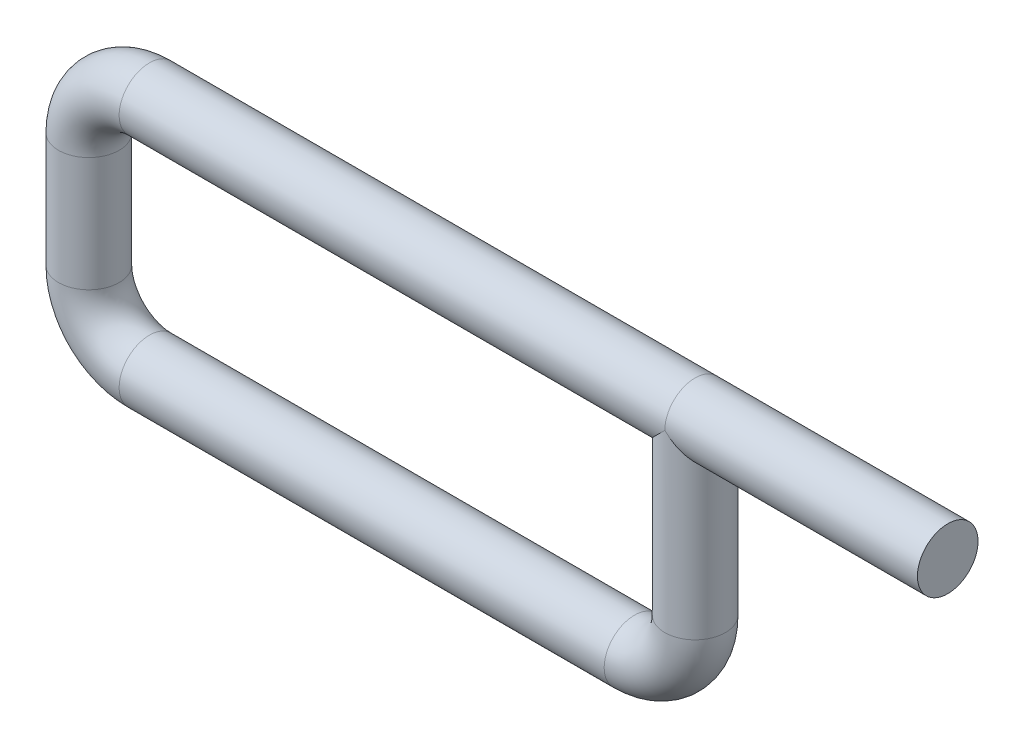
ISO-10303-21;
HEADER;
FILE_DESCRIPTION(('STEP AP214'),'2;1');
FILE_NAME('part.step','',(''),(''),'','','');
FILE_SCHEMA(('AUTOMOTIVE_DESIGN { 1 0 10303 214 1 1 1 1 }'));
ENDSEC;
DATA;
#1=APPLICATION_CONTEXT('core data for automotive mechanical design processes');
#2=APPLICATION_PROTOCOL_DEFINITION('international standard','automotive_design',2000,#1);
#3=PRODUCT_CONTEXT('',#1,'mechanical');
#4=PRODUCT('Part','Part','',(#3));
#5=PRODUCT_RELATED_PRODUCT_CATEGORY('part','',(#4));
#6=PRODUCT_DEFINITION_FORMATION('','',#4);
#7=PRODUCT_DEFINITION_CONTEXT('part definition',#1,'design');
#8=PRODUCT_DEFINITION('design','',#6,#7);
#9=PRODUCT_DEFINITION_SHAPE('','',#8);
#10=(LENGTH_UNIT() NAMED_UNIT(*) SI_UNIT(.MILLI.,.METRE.));
#11=(NAMED_UNIT(*) PLANE_ANGLE_UNIT() SI_UNIT($,.RADIAN.));
#12=(NAMED_UNIT(*) SI_UNIT($,.STERADIAN.) SOLID_ANGLE_UNIT());
#13=UNCERTAINTY_MEASURE_WITH_UNIT(LENGTH_MEASURE(1.E-05),#10,'distance_accuracy_value','');
#14=(GEOMETRIC_REPRESENTATION_CONTEXT(3) GLOBAL_UNCERTAINTY_ASSIGNED_CONTEXT((#13)) GLOBAL_UNIT_ASSIGNED_CONTEXT((#10,
#11,#12)) REPRESENTATION_CONTEXT('',''));
#15=CARTESIAN_POINT('',(0.,0.,0.));
#16=DIRECTION('',(0.,0.,1.));
#17=DIRECTION('',(1.,0.,0.));
#18=AXIS2_PLACEMENT_3D('',#15,#16,#17);
#19=CARTESIAN_POINT('',(717.,1070.,515.000000000015));
#20=DIRECTION('',(-1.,0.,0.));
#21=DIRECTION('',(0.,0.,1.));
#22=AXIS2_PLACEMENT_3D('',#19,#20,#21);
#23=PLANE('',#22);
#24=CARTESIAN_POINT('',(717.,1070.,515.000000000015));
#25=DIRECTION('',(-1.,0.,0.));
#26=DIRECTION('',(0.,0.,1.));
#27=AXIS2_PLACEMENT_3D('',#24,#25,#26);
#28=CIRCLE('',#27,9.00000000000001);
#29=CARTESIAN_POINT('',(717.,1070.,524.000000000015));
#30=VERTEX_POINT('',#29);
#31=EDGE_CURVE('E42',#30,#30,#28,.T.);
#32=ORIENTED_EDGE('',*,*,#31,.F.);
#33=EDGE_LOOP('',(#32));
#34=FACE_BOUND('',#33,.T.);
#35=ADVANCED_FACE('F35',(#34),#23,.F.);
#36=CARTESIAN_POINT('',(624.,1018.,515.000000000015));
#37=DIRECTION('',(0.,0.,-1.));
#38=DIRECTION('',(-1.,0.,0.));
#39=AXIS2_PLACEMENT_3D('',#36,#37,#38);
#40=TOROIDAL_SURFACE('',#39,18.0000000000001,9.00000000000001);
#41=CARTESIAN_POINT('',(642.,1018.,515.000000000015));
#42=DIRECTION('',(0.,1.,0.));
#43=DIRECTION('',(0.,0.,1.));
#44=AXIS2_PLACEMENT_3D('',#41,#42,#43);
#45=CIRCLE('',#44,9.00000000000001);
#46=CARTESIAN_POINT('',(651.,1018.,515.000000000015));
#47=VERTEX_POINT('',#46);
#48=EDGE_CURVE('E57',#47,#47,#45,.T.);
#49=CARTESIAN_POINT('',(624.,1000.,515.000000000015));
#50=DIRECTION('',(1.,0.,0.));
#51=DIRECTION('',(0.,0.,1.));
#52=AXIS2_PLACEMENT_3D('',#49,#50,#51);
#53=CIRCLE('',#52,9.00000000000001);
#54=CARTESIAN_POINT('',(624.,990.999999999999,515.000000000015));
#55=VERTEX_POINT('',#54);
#56=EDGE_CURVE('E75',#55,#55,#53,.T.);
#57=CARTESIAN_POINT('',(624.,1018.,515.000000000015));
#58=DIRECTION('',(0.,0.,-1.));
#59=DIRECTION('',(-1.,0.,0.));
#60=AXIS2_PLACEMENT_3D('',#57,#58,#59);
#61=CIRCLE('',#60,27.0000000000001);
#62=EDGE_CURVE('',#47,#55,#61,.T.);
#63=ORIENTED_EDGE('',*,*,#48,.F.);
#64=ORIENTED_EDGE('',*,*,#56,.T.);
#65=ORIENTED_EDGE('',*,*,#62,.T.);
#66=ORIENTED_EDGE('',*,*,#62,.F.);
#67=EDGE_LOOP('',(#63,#65,#64,#66));
#68=FACE_BOUND('',#67,.T.);
#69=ADVANCED_FACE('F82',(#68),#40,.T.);
#70=CARTESIAN_POINT('',(624.,999.999999999999,515.000000000015));
#71=DIRECTION('',(-1.,0.,0.));
#72=DIRECTION('',(0.,-1.,0.));
#73=AXIS2_PLACEMENT_3D('',#70,#71,#72);
#74=CYLINDRICAL_SURFACE('',#73,9.00000000000001);
#75=CARTESIAN_POINT('',(480.,999.999999999999,515.000000000015));
#76=DIRECTION('',(1.,0.,0.));
#77=DIRECTION('',(0.,0.,1.));
#78=AXIS2_PLACEMENT_3D('',#75,#76,#77);
#79=CIRCLE('',#78,9.00000000000001);
#80=CARTESIAN_POINT('',(480.,991.,515.000000000015));
#81=VERTEX_POINT('',#80);
#82=EDGE_CURVE('E72',#81,#81,#79,.T.);
#83=ORIENTED_EDGE('',*,*,#82,.T.);
#84=EDGE_LOOP('',(#83));
#85=FACE_BOUND('',#84,.T.);
#86=ORIENTED_EDGE('',*,*,#56,.F.);
#87=EDGE_LOOP('',(#86));
#88=FACE_BOUND('',#87,.T.);
#89=ADVANCED_FACE('F84',(#85,#88),#74,.T.);
#90=CARTESIAN_POINT('',(480.,1018.,515.000000000015));
#91=DIRECTION('',(0.,0.,-1.));
#92=DIRECTION('',(-1.,0.,0.));
#93=AXIS2_PLACEMENT_3D('',#90,#91,#92);
#94=TOROIDAL_SURFACE('',#93,17.9999999999998,9.00000000000001);
#95=CARTESIAN_POINT('',(462.,1018.,515.000000000015));
#96=DIRECTION('',(0.,-1.,0.));
#97=DIRECTION('',(0.,0.,1.));
#98=AXIS2_PLACEMENT_3D('',#95,#96,#97);
#99=CIRCLE('',#98,9.00000000000001);
#100=CARTESIAN_POINT('',(453.,1018.,515.000000000015));
#101=VERTEX_POINT('',#100);
#102=EDGE_CURVE('E69',#101,#101,#99,.T.);
#103=CARTESIAN_POINT('',(480.,1018.,515.000000000015));
#104=DIRECTION('',(0.,0.,-1.));
#105=DIRECTION('',(-1.,0.,0.));
#106=AXIS2_PLACEMENT_3D('',#103,#104,#105);
#107=CIRCLE('',#106,26.9999999999998);
#108=EDGE_CURVE('',#81,#101,#107,.T.);
#109=ORIENTED_EDGE('',*,*,#82,.F.);
#110=ORIENTED_EDGE('',*,*,#102,.T.);
#111=ORIENTED_EDGE('',*,*,#108,.T.);
#112=ORIENTED_EDGE('',*,*,#108,.F.);
#113=EDGE_LOOP('',(#109,#111,#110,#112));
#114=FACE_BOUND('',#113,.T.);
#115=ADVANCED_FACE('F91',(#114),#94,.T.);
#116=CARTESIAN_POINT('',(462.,1018.,515.000000000015));
#117=DIRECTION('',(0.,1.,0.));
#118=DIRECTION('',(0.,0.,1.));
#119=AXIS2_PLACEMENT_3D('',#116,#117,#118);
#120=CYLINDRICAL_SURFACE('',#119,9.00000000000001);
#121=CARTESIAN_POINT('',(462.,1052.,515.000000000015));
#122=DIRECTION('',(0.,-1.,0.));
#123=DIRECTION('',(0.,0.,1.));
#124=AXIS2_PLACEMENT_3D('',#121,#122,#123);
#125=CIRCLE('',#124,9.00000000000001);
#126=CARTESIAN_POINT('',(453.,1052.,515.000000000015));
#127=VERTEX_POINT('',#126);
#128=EDGE_CURVE('E64',#127,#127,#125,.T.);
#129=ORIENTED_EDGE('',*,*,#128,.T.);
#130=EDGE_LOOP('',(#129));
#131=FACE_BOUND('',#130,.T.);
#132=ORIENTED_EDGE('',*,*,#102,.F.);
#133=EDGE_LOOP('',(#132));
#134=FACE_BOUND('',#133,.T.);
#135=ADVANCED_FACE('F107',(#131,#134),#120,.T.);
#136=CARTESIAN_POINT('',(480.,1052.,515.000000000015));
#137=DIRECTION('',(0.,0.,-1.));
#138=DIRECTION('',(-1.,0.,0.));
#139=AXIS2_PLACEMENT_3D('',#136,#137,#138);
#140=TOROIDAL_SURFACE('',#139,18.,9.00000000000001);
#141=CARTESIAN_POINT('',(480.,1070.,515.000000000015));
#142=DIRECTION('',(-1.,0.,0.));
#143=DIRECTION('',(0.,0.,1.));
#144=AXIS2_PLACEMENT_3D('',#141,#142,#143);
#145=CIRCLE('',#144,9.00000000000001);
#146=CARTESIAN_POINT('',(480.,1079.,515.000000000015));
#147=VERTEX_POINT('',#146);
#148=EDGE_CURVE('E60',#147,#147,#145,.T.);
#149=CARTESIAN_POINT('',(480.,1052.,515.000000000015));
#150=DIRECTION('',(0.,0.,-1.));
#151=DIRECTION('',(-1.,0.,0.));
#152=AXIS2_PLACEMENT_3D('',#149,#150,#151);
#153=CIRCLE('',#152,27.);
#154=EDGE_CURVE('',#127,#147,#153,.T.);
#155=ORIENTED_EDGE('',*,*,#128,.F.);
#156=ORIENTED_EDGE('',*,*,#148,.T.);
#157=ORIENTED_EDGE('',*,*,#154,.T.);
#158=ORIENTED_EDGE('',*,*,#154,.F.);
#159=EDGE_LOOP('',(#155,#157,#156,#158));
#160=FACE_BOUND('',#159,.T.);
#161=ADVANCED_FACE('F102',(#160),#140,.T.);
#162=CARTESIAN_POINT('',(480.,1070.,515.000000000015));
#163=DIRECTION('',(1.,0.,0.));
#164=DIRECTION('',(0.,0.,-1.));
#165=AXIS2_PLACEMENT_3D('',#162,#163,#164);
#166=CYLINDRICAL_SURFACE('',#165,9.00000000000001);
#167=CARTESIAN_POINT('',(642.,1070.,515.000000000015));
#168=DIRECTION('',(-1.,0.,0.));
#169=DIRECTION('',(0.,0.,1.));
#170=AXIS2_PLACEMENT_3D('',#167,#168,#169);
#171=CIRCLE('',#170,9.00000000000001);
#172=CARTESIAN_POINT('',(642.,1070.,524.000000000015));
#173=VERTEX_POINT('',#172);
#174=CARTESIAN_POINT('',(642.,1070.,506.000000000015));
#175=VERTEX_POINT('',#174);
#176=EDGE_CURVE('E56',#173,#175,#171,.T.);
#177=ORIENTED_EDGE('',*,*,#176,.T.);
#178=CARTESIAN_POINT('',(642.,1070.,515.000000000015));
#179=DIRECTION('',(0.707106781186547,-0.707106781186547,0.));
#180=DIRECTION('',(0.707106781186547,0.707106781186547,0.));
#181=AXIS2_PLACEMENT_3D('',#178,#179,#180);
#182=ELLIPSE('',#181,12.7279220613579,9.00000000000001);
#183=EDGE_CURVE('E48',#175,#173,#182,.F.);
#184=ORIENTED_EDGE('',*,*,#183,.T.);
#185=EDGE_LOOP('',(#177,#184));
#186=FACE_BOUND('',#185,.T.);
#187=ORIENTED_EDGE('',*,*,#148,.F.);
#188=EDGE_LOOP('',(#187));
#189=FACE_BOUND('',#188,.T.);
#190=ADVANCED_FACE('F54',(#186,#189),#166,.T.);
#191=CARTESIAN_POINT('',(642.,1070.,515.000000000015));
#192=DIRECTION('',(1.,0.,0.));
#193=DIRECTION('',(0.,0.,-1.));
#194=AXIS2_PLACEMENT_3D('',#191,#192,#193);
#195=CYLINDRICAL_SURFACE('',#194,9.00000000000001);
#196=ORIENTED_EDGE('',*,*,#31,.T.);
#197=EDGE_LOOP('',(#196));
#198=FACE_BOUND('',#197,.T.);
#199=ORIENTED_EDGE('',*,*,#176,.F.);
#200=CARTESIAN_POINT('',(642.,1070.,515.000000000015));
#201=DIRECTION('',(0.707106781186547,0.707106781186547,0.));
#202=DIRECTION('',(0.707106781186547,-0.707106781186547,0.));
#203=AXIS2_PLACEMENT_3D('',#200,#201,#202);
#204=ELLIPSE('',#203,12.7279220613579,9.00000000000001);
#205=EDGE_CURVE('E11',#173,#175,#204,.T.);
#206=ORIENTED_EDGE('',*,*,#205,.T.);
#207=EDGE_LOOP('',(#199,#206));
#208=FACE_BOUND('',#207,.T.);
#209=ADVANCED_FACE('F59',(#198,#208),#195,.T.);
#210=CARTESIAN_POINT('',(642.,1070.,515.000000000015));
#211=DIRECTION('',(0.,-1.,0.));
#212=DIRECTION('',(0.,0.,-1.));
#213=AXIS2_PLACEMENT_3D('',#210,#211,#212);
#214=CYLINDRICAL_SURFACE('',#213,9.00000000000001);
#215=ORIENTED_EDGE('',*,*,#48,.T.);
#216=EDGE_LOOP('',(#215));
#217=FACE_BOUND('',#216,.T.);
#218=ORIENTED_EDGE('',*,*,#183,.F.);
#219=ORIENTED_EDGE('',*,*,#205,.F.);
#220=EDGE_LOOP('',(#218,#219));
#221=FACE_BOUND('',#220,.T.);
#222=ADVANCED_FACE('F49',(#217,#221),#214,.T.);
#223=CLOSED_SHELL('',(#35,#69,#89,#115,#135,#161,#190,#209,#222));
#224=MANIFOLD_SOLID_BREP('B2',#223);
#225=ADVANCED_BREP_SHAPE_REPRESENTATION('',(#18,#224),#14);
#226=SHAPE_DEFINITION_REPRESENTATION(#9,#225);
ENDSEC;
END-ISO-10303-21;
